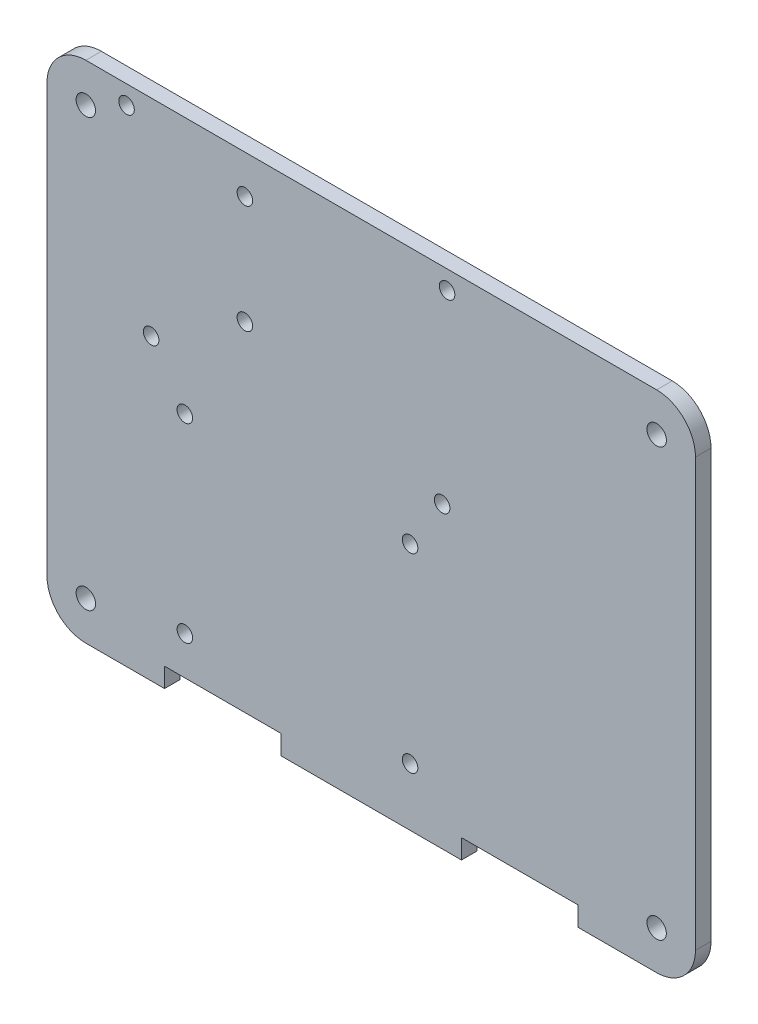
ISO-10303-21;
HEADER;
FILE_DESCRIPTION(('STEP AP214'),'2;1');
FILE_NAME('part.step','',(''),(''),'','','');
FILE_SCHEMA(('AUTOMOTIVE_DESIGN { 1 0 10303 214 1 1 1 1 }'));
ENDSEC;
DATA;
#1=APPLICATION_CONTEXT('core data for automotive mechanical design processes');
#2=APPLICATION_PROTOCOL_DEFINITION('international standard','automotive_design',2000,#1);
#3=PRODUCT_CONTEXT('',#1,'mechanical');
#4=PRODUCT('Part','Part','',(#3));
#5=PRODUCT_RELATED_PRODUCT_CATEGORY('part','',(#4));
#6=PRODUCT_DEFINITION_FORMATION('','',#4);
#7=PRODUCT_DEFINITION_CONTEXT('part definition',#1,'design');
#8=PRODUCT_DEFINITION('design','',#6,#7);
#9=PRODUCT_DEFINITION_SHAPE('','',#8);
#10=(LENGTH_UNIT() NAMED_UNIT(*) SI_UNIT(.MILLI.,.METRE.));
#11=(NAMED_UNIT(*) PLANE_ANGLE_UNIT() SI_UNIT($,.RADIAN.));
#12=(NAMED_UNIT(*) SI_UNIT($,.STERADIAN.) SOLID_ANGLE_UNIT());
#13=UNCERTAINTY_MEASURE_WITH_UNIT(LENGTH_MEASURE(1.E-05),#10,'distance_accuracy_value','');
#14=(GEOMETRIC_REPRESENTATION_CONTEXT(3) GLOBAL_UNCERTAINTY_ASSIGNED_CONTEXT((#13)) GLOBAL_UNIT_ASSIGNED_CONTEXT((#10,
#11,#12)) REPRESENTATION_CONTEXT('',''));
#15=CARTESIAN_POINT('',(0.,0.,0.));
#16=DIRECTION('',(0.,0.,1.));
#17=DIRECTION('',(1.,0.,0.));
#18=AXIS2_PLACEMENT_3D('',#15,#16,#17);
#19=CARTESIAN_POINT('',(-83.5,-65.,4.));
#20=DIRECTION('',(0.,1.,0.));
#21=DIRECTION('',(0.,0.,1.));
#22=AXIS2_PLACEMENT_3D('',#19,#20,#21);
#23=PLANE('',#22);
#24=DIRECTION('',(1.,0.,0.));
#25=VECTOR('',#24,1.);
#26=CARTESIAN_POINT('',(-83.5,-65.,0.));
#27=LINE('',#26,#25);
#28=CARTESIAN_POINT('',(-73.5,-65.,0.));
#29=VERTEX_POINT('',#28);
#30=CARTESIAN_POINT('',(-53.2337974141173,-65.,0.));
#31=VERTEX_POINT('',#30);
#32=EDGE_CURVE('E164',#29,#31,#27,.T.);
#33=ORIENTED_EDGE('',*,*,#32,.T.);
#34=DIRECTION('',(0.,0.,1.));
#35=VECTOR('',#34,1.);
#36=CARTESIAN_POINT('',(-53.2337974141173,-65.,-6.));
#37=LINE('',#36,#35);
#38=CARTESIAN_POINT('',(-53.2337974141173,-65.,4.));
#39=VERTEX_POINT('',#38);
#40=EDGE_CURVE('E147',#31,#39,#37,.T.);
#41=ORIENTED_EDGE('',*,*,#40,.T.);
#42=DIRECTION('',(1.,0.,0.));
#43=VECTOR('',#42,1.);
#44=CARTESIAN_POINT('',(-83.5,-65.,4.));
#45=LINE('',#44,#43);
#46=CARTESIAN_POINT('',(-73.5,-65.,4.));
#47=VERTEX_POINT('',#46);
#48=EDGE_CURVE('E161',#47,#39,#45,.T.);
#49=ORIENTED_EDGE('',*,*,#48,.F.);
#50=DIRECTION('',(0.,0.,-1.));
#51=VECTOR('',#50,1.);
#52=CARTESIAN_POINT('',(-73.5,-65.,4.));
#53=LINE('',#52,#51);
#54=EDGE_CURVE('E173',#47,#29,#53,.T.);
#55=ORIENTED_EDGE('',*,*,#54,.T.);
#56=EDGE_LOOP('',(#33,#41,#49,#55));
#57=FACE_BOUND('',#56,.T.);
#58=ADVANCED_FACE('F32',(#57),#23,.F.);
#59=CARTESIAN_POINT('',(53.2337974141174,-65.,4.));
#60=VERTEX_POINT('',#59);
#61=CARTESIAN_POINT('',(73.5,-65.,4.));
#62=VERTEX_POINT('',#61);
#63=EDGE_CURVE('E176',#60,#62,#45,.T.);
#64=ORIENTED_EDGE('',*,*,#63,.F.);
#65=DIRECTION('',(0.,0.,1.));
#66=VECTOR('',#65,1.);
#67=CARTESIAN_POINT('',(53.2337974141174,-65.,-6.));
#68=LINE('',#67,#66);
#69=CARTESIAN_POINT('',(53.2337974141174,-65.,0.));
#70=VERTEX_POINT('',#69);
#71=EDGE_CURVE('E155',#70,#60,#68,.T.);
#72=ORIENTED_EDGE('',*,*,#71,.F.);
#73=CARTESIAN_POINT('',(73.5,-65.,0.));
#74=VERTEX_POINT('',#73);
#75=EDGE_CURVE('E424',#70,#74,#27,.T.);
#76=ORIENTED_EDGE('',*,*,#75,.T.);
#77=DIRECTION('',(0.,0.,-1.));
#78=VECTOR('',#77,1.);
#79=CARTESIAN_POINT('',(73.5000000000001,-65.,4.));
#80=LINE('',#79,#78);
#81=EDGE_CURVE('E395',#74,#62,#80,.F.);
#82=ORIENTED_EDGE('',*,*,#81,.T.);
#83=EDGE_LOOP('',(#64,#72,#76,#82));
#84=FACE_BOUND('',#83,.T.);
#85=ADVANCED_FACE('F337',(#84),#23,.F.);
#86=CARTESIAN_POINT('',(83.5,65.,4.));
#87=DIRECTION('',(-1.,0.,0.));
#88=DIRECTION('',(0.,-1.,0.));
#89=AXIS2_PLACEMENT_3D('',#86,#87,#88);
#90=PLANE('',#89);
#91=DIRECTION('',(0.,1.,0.));
#92=VECTOR('',#91,1.);
#93=CARTESIAN_POINT('',(83.5,65.,4.));
#94=LINE('',#93,#92);
#95=CARTESIAN_POINT('',(83.5,-55.,4.));
#96=VERTEX_POINT('',#95);
#97=CARTESIAN_POINT('',(83.5,55.,4.));
#98=VERTEX_POINT('',#97);
#99=EDGE_CURVE('E188',#96,#98,#94,.T.);
#100=ORIENTED_EDGE('',*,*,#99,.F.);
#101=DIRECTION('',(0.,0.,-1.));
#102=VECTOR('',#101,1.);
#103=CARTESIAN_POINT('',(83.5,-55.,4.));
#104=LINE('',#103,#102);
#105=CARTESIAN_POINT('',(83.5,-55.,0.));
#106=VERTEX_POINT('',#105);
#107=EDGE_CURVE('E402',#96,#106,#104,.T.);
#108=ORIENTED_EDGE('',*,*,#107,.T.);
#109=DIRECTION('',(0.,1.,0.));
#110=VECTOR('',#109,1.);
#111=CARTESIAN_POINT('',(83.5,65.,0.));
#112=LINE('',#111,#110);
#113=CARTESIAN_POINT('',(83.5,55.,0.));
#114=VERTEX_POINT('',#113);
#115=EDGE_CURVE('E380',#106,#114,#112,.T.);
#116=ORIENTED_EDGE('',*,*,#115,.T.);
#117=DIRECTION('',(0.,0.,-1.));
#118=VECTOR('',#117,1.);
#119=CARTESIAN_POINT('',(83.5,55.,4.));
#120=LINE('',#119,#118);
#121=EDGE_CURVE('E405',#114,#98,#120,.F.);
#122=ORIENTED_EDGE('',*,*,#121,.T.);
#123=EDGE_LOOP('',(#100,#108,#116,#122));
#124=FACE_BOUND('',#123,.T.);
#125=ADVANCED_FACE('F342',(#124),#90,.F.);
#126=CARTESIAN_POINT('',(-83.5,65.,4.));
#127=DIRECTION('',(0.,-1.,0.));
#128=DIRECTION('',(0.,0.,-1.));
#129=AXIS2_PLACEMENT_3D('',#126,#127,#128);
#130=PLANE('',#129);
#131=DIRECTION('',(-1.,0.,0.));
#132=VECTOR('',#131,1.);
#133=CARTESIAN_POINT('',(-83.5,65.,4.));
#134=LINE('',#133,#132);
#135=CARTESIAN_POINT('',(73.5,65.,4.));
#136=VERTEX_POINT('',#135);
#137=CARTESIAN_POINT('',(-73.5,65.,4.));
#138=VERTEX_POINT('',#137);
#139=EDGE_CURVE('E186',#136,#138,#134,.T.);
#140=ORIENTED_EDGE('',*,*,#139,.F.);
#141=DIRECTION('',(0.,0.,-1.));
#142=VECTOR('',#141,1.);
#143=CARTESIAN_POINT('',(73.5,65.,4.));
#144=LINE('',#143,#142);
#145=CARTESIAN_POINT('',(73.5,65.,0.));
#146=VERTEX_POINT('',#145);
#147=EDGE_CURVE('E376',#136,#146,#144,.T.);
#148=ORIENTED_EDGE('',*,*,#147,.T.);
#149=DIRECTION('',(-1.,0.,0.));
#150=VECTOR('',#149,1.);
#151=CARTESIAN_POINT('',(-83.5,65.,0.));
#152=LINE('',#151,#150);
#153=CARTESIAN_POINT('',(-73.5,65.,0.));
#154=VERTEX_POINT('',#153);
#155=EDGE_CURVE('E428',#146,#154,#152,.T.);
#156=ORIENTED_EDGE('',*,*,#155,.T.);
#157=DIRECTION('',(0.,0.,-1.));
#158=VECTOR('',#157,1.);
#159=CARTESIAN_POINT('',(-73.5,65.,4.));
#160=LINE('',#159,#158);
#161=EDGE_CURVE('E407',#154,#138,#160,.F.);
#162=ORIENTED_EDGE('',*,*,#161,.T.);
#163=EDGE_LOOP('',(#140,#148,#156,#162));
#164=FACE_BOUND('',#163,.T.);
#165=ADVANCED_FACE('F352',(#164),#130,.F.);
#166=CARTESIAN_POINT('',(-83.5,65.,4.));
#167=DIRECTION('',(1.,0.,0.));
#168=DIRECTION('',(0.,1.,0.));
#169=AXIS2_PLACEMENT_3D('',#166,#167,#168);
#170=PLANE('',#169);
#171=DIRECTION('',(0.,-1.,0.));
#172=VECTOR('',#171,1.);
#173=CARTESIAN_POINT('',(-83.5,65.,0.));
#174=LINE('',#173,#172);
#175=CARTESIAN_POINT('',(-83.5,55.,0.));
#176=VERTEX_POINT('',#175);
#177=CARTESIAN_POINT('',(-83.5,-55.,0.));
#178=VERTEX_POINT('',#177);
#179=EDGE_CURVE('E425',#176,#178,#174,.T.);
#180=ORIENTED_EDGE('',*,*,#179,.T.);
#181=DIRECTION('',(0.,0.,-1.));
#182=VECTOR('',#181,1.);
#183=CARTESIAN_POINT('',(-83.5,-55.,4.));
#184=LINE('',#183,#182);
#185=CARTESIAN_POINT('',(-83.5,-55.,4.));
#186=VERTEX_POINT('',#185);
#187=EDGE_CURVE('E413',#178,#186,#184,.F.);
#188=ORIENTED_EDGE('',*,*,#187,.T.);
#189=DIRECTION('',(0.,-1.,0.));
#190=VECTOR('',#189,1.);
#191=CARTESIAN_POINT('',(-83.5,65.,4.));
#192=LINE('',#191,#190);
#193=CARTESIAN_POINT('',(-83.5,55.,4.));
#194=VERTEX_POINT('',#193);
#195=EDGE_CURVE('E182',#194,#186,#192,.T.);
#196=ORIENTED_EDGE('',*,*,#195,.F.);
#197=DIRECTION('',(0.,0.,-1.));
#198=VECTOR('',#197,1.);
#199=CARTESIAN_POINT('',(-83.5,55.,4.));
#200=LINE('',#199,#198);
#201=EDGE_CURVE('E415',#194,#176,#200,.T.);
#202=ORIENTED_EDGE('',*,*,#201,.T.);
#203=EDGE_LOOP('',(#180,#188,#196,#202));
#204=FACE_BOUND('',#203,.T.);
#205=ADVANCED_FACE('F347',(#204),#170,.F.);
#206=CARTESIAN_POINT('',(-23.2337974141174,-65.,4.));
#207=VERTEX_POINT('',#206);
#208=CARTESIAN_POINT('',(23.2337974141174,-65.,4.));
#209=VERTEX_POINT('',#208);
#210=EDGE_CURVE('E174',#207,#209,#45,.T.);
#211=ORIENTED_EDGE('',*,*,#210,.F.);
#212=DIRECTION('',(0.,0.,1.));
#213=VECTOR('',#212,1.);
#214=CARTESIAN_POINT('',(-23.2337974141174,-65.,-6.));
#215=LINE('',#214,#213);
#216=CARTESIAN_POINT('',(-23.2337974141174,-65.,0.));
#217=VERTEX_POINT('',#216);
#218=EDGE_CURVE('E165',#217,#207,#215,.T.);
#219=ORIENTED_EDGE('',*,*,#218,.F.);
#220=CARTESIAN_POINT('',(23.2337974141174,-65.,0.));
#221=VERTEX_POINT('',#220);
#222=EDGE_CURVE('E423',#217,#221,#27,.T.);
#223=ORIENTED_EDGE('',*,*,#222,.T.);
#224=DIRECTION('',(0.,0.,1.));
#225=VECTOR('',#224,1.);
#226=CARTESIAN_POINT('',(23.2337974141174,-65.,-6.));
#227=LINE('',#226,#225);
#228=EDGE_CURVE('E210',#221,#209,#227,.T.);
#229=ORIENTED_EDGE('',*,*,#228,.T.);
#230=EDGE_LOOP('',(#211,#219,#223,#229));
#231=FACE_BOUND('',#230,.T.);
#232=ADVANCED_FACE('F298',(#231),#23,.F.);
#233=CARTESIAN_POINT('',(0.,0.,4.));
#234=DIRECTION('',(0.,0.,1.));
#235=DIRECTION('',(1.,0.,0.));
#236=AXIS2_PLACEMENT_3D('',#233,#234,#235);
#237=PLANE('',#236);
#238=CARTESIAN_POINT('',(-63.0199999999999,60.1901793205921,4.));
#239=DIRECTION('',(0.,0.,1.));
#240=DIRECTION('',(1.,0.,0.));
#241=AXIS2_PLACEMENT_3D('',#238,#239,#240);
#242=CIRCLE('',#241,2.);
#243=CARTESIAN_POINT('',(-61.0199999999999,60.1901793205921,4.));
#244=VERTEX_POINT('',#243);
#245=EDGE_CURVE('E280',#244,#244,#242,.T.);
#246=ORIENTED_EDGE('',*,*,#245,.F.);
#247=EDGE_LOOP('',(#246));
#248=FACE_BOUND('',#247,.T.);
#249=CARTESIAN_POINT('',(-32.5399999999999,55.1101793205921,4.));
#250=DIRECTION('',(0.,0.,1.));
#251=DIRECTION('',(1.,0.,0.));
#252=AXIS2_PLACEMENT_3D('',#249,#250,#251);
#253=CIRCLE('',#252,2.);
#254=CARTESIAN_POINT('',(-30.5399999999999,55.1101793205921,4.));
#255=VERTEX_POINT('',#254);
#256=EDGE_CURVE('E274',#255,#255,#253,.T.);
#257=ORIENTED_EDGE('',*,*,#256,.F.);
#258=EDGE_LOOP('',(#257));
#259=FACE_BOUND('',#258,.T.);
#260=CARTESIAN_POINT('',(-32.5399999999999,27.1701793205921,4.));
#261=DIRECTION('',(0.,0.,1.));
#262=DIRECTION('',(1.,0.,0.));
#263=AXIS2_PLACEMENT_3D('',#260,#261,#262);
#264=CIRCLE('',#263,2.);
#265=CARTESIAN_POINT('',(-30.5399999999999,27.1701793205921,4.));
#266=VERTEX_POINT('',#265);
#267=EDGE_CURVE('E268',#266,#266,#264,.T.);
#268=ORIENTED_EDGE('',*,*,#267,.F.);
#269=EDGE_LOOP('',(#268));
#270=FACE_BOUND('',#269,.T.);
#271=CARTESIAN_POINT('',(19.5300000000001,60.1901793205921,4.));
#272=DIRECTION('',(0.,0.,1.));
#273=DIRECTION('',(1.,0.,0.));
#274=AXIS2_PLACEMENT_3D('',#271,#272,#273);
#275=CIRCLE('',#274,2.);
#276=CARTESIAN_POINT('',(21.5300000000001,60.1901793205921,4.));
#277=VERTEX_POINT('',#276);
#278=EDGE_CURVE('E262',#277,#277,#275,.T.);
#279=ORIENTED_EDGE('',*,*,#278,.F.);
#280=EDGE_LOOP('',(#279));
#281=FACE_BOUND('',#280,.T.);
#282=CARTESIAN_POINT('',(18.2600000000001,11.9301793205921,4.));
#283=DIRECTION('',(0.,0.,1.));
#284=DIRECTION('',(1.,0.,0.));
#285=AXIS2_PLACEMENT_3D('',#282,#283,#284);
#286=CIRCLE('',#285,2.);
#287=CARTESIAN_POINT('',(20.2600000000001,11.9301793205921,4.));
#288=VERTEX_POINT('',#287);
#289=EDGE_CURVE('E256',#288,#288,#286,.T.);
#290=ORIENTED_EDGE('',*,*,#289,.F.);
#291=EDGE_LOOP('',(#290));
#292=FACE_BOUND('',#291,.T.);
#293=CARTESIAN_POINT('',(-56.6699999999999,11.9301793205921,4.));
#294=DIRECTION('',(0.,0.,1.));
#295=DIRECTION('',(1.,0.,0.));
#296=AXIS2_PLACEMENT_3D('',#293,#294,#295);
#297=CIRCLE('',#296,2.);
#298=CARTESIAN_POINT('',(-54.6699999999999,11.9301793205921,4.));
#299=VERTEX_POINT('',#298);
#300=EDGE_CURVE('E250',#299,#299,#297,.T.);
#301=ORIENTED_EDGE('',*,*,#300,.F.);
#302=EDGE_LOOP('',(#301));
#303=FACE_BOUND('',#302,.T.);
#304=CARTESIAN_POINT('',(10.,-1.10624537225093,4.));
#305=DIRECTION('',(0.,0.,1.));
#306=DIRECTION('',(1.,0.,0.));
#307=AXIS2_PLACEMENT_3D('',#304,#305,#306);
#308=CIRCLE('',#307,2.);
#309=CARTESIAN_POINT('',(12.,-1.10624537225093,4.));
#310=VERTEX_POINT('',#309);
#311=EDGE_CURVE('E232',#310,#310,#308,.T.);
#312=ORIENTED_EDGE('',*,*,#311,.F.);
#313=EDGE_LOOP('',(#312));
#314=FACE_BOUND('',#313,.T.);
#315=CARTESIAN_POINT('',(-48.,-50.106245372251,4.));
#316=DIRECTION('',(0.,0.,1.));
#317=DIRECTION('',(1.,0.,0.));
#318=AXIS2_PLACEMENT_3D('',#315,#316,#317);
#319=CIRCLE('',#318,2.);
#320=CARTESIAN_POINT('',(-46.,-50.106245372251,4.));
#321=VERTEX_POINT('',#320);
#322=EDGE_CURVE('E239',#321,#321,#319,.T.);
#323=ORIENTED_EDGE('',*,*,#322,.F.);
#324=EDGE_LOOP('',(#323));
#325=FACE_BOUND('',#324,.T.);
#326=CARTESIAN_POINT('',(10.,-50.1062453722509,4.));
#327=DIRECTION('',(0.,0.,1.));
#328=DIRECTION('',(1.,0.,0.));
#329=AXIS2_PLACEMENT_3D('',#326,#327,#328);
#330=CIRCLE('',#329,2.);
#331=CARTESIAN_POINT('',(12.,-50.1062453722509,4.));
#332=VERTEX_POINT('',#331);
#333=EDGE_CURVE('E245',#332,#332,#330,.T.);
#334=ORIENTED_EDGE('',*,*,#333,.F.);
#335=EDGE_LOOP('',(#334));
#336=FACE_BOUND('',#335,.T.);
#337=CARTESIAN_POINT('',(-48.,-1.10624537225095,4.));
#338=DIRECTION('',(0.,0.,1.));
#339=DIRECTION('',(1.,0.,0.));
#340=AXIS2_PLACEMENT_3D('',#337,#338,#339);
#341=CIRCLE('',#340,2.);
#342=CARTESIAN_POINT('',(-46.,-1.10624537225095,4.));
#343=VERTEX_POINT('',#342);
#344=EDGE_CURVE('E226',#343,#343,#341,.T.);
#345=ORIENTED_EDGE('',*,*,#344,.F.);
#346=EDGE_LOOP('',(#345));
#347=FACE_BOUND('',#346,.T.);
#348=DIRECTION('',(0.,-1.,0.));
#349=VECTOR('',#348,1.);
#350=CARTESIAN_POINT('',(-53.2337974141173,-65.,4.));
#351=LINE('',#350,#349);
#352=CARTESIAN_POINT('',(-53.2337974141173,-60.,4.));
#353=VERTEX_POINT('',#352);
#354=EDGE_CURVE('E144',#353,#39,#351,.T.);
#355=ORIENTED_EDGE('',*,*,#354,.F.);
#356=DIRECTION('',(-1.,0.,0.));
#357=VECTOR('',#356,1.);
#358=CARTESIAN_POINT('',(-53.2337974141173,-60.,4.));
#359=LINE('',#358,#357);
#360=CARTESIAN_POINT('',(-23.2337974141174,-60.,4.));
#361=VERTEX_POINT('',#360);
#362=EDGE_CURVE('E166',#361,#353,#359,.T.);
#363=ORIENTED_EDGE('',*,*,#362,.F.);
#364=DIRECTION('',(0.,1.,0.));
#365=VECTOR('',#364,1.);
#366=CARTESIAN_POINT('',(-23.2337974141174,-65.,4.));
#367=LINE('',#366,#365);
#368=EDGE_CURVE('E154',#207,#361,#367,.T.);
#369=ORIENTED_EDGE('',*,*,#368,.F.);
#370=ORIENTED_EDGE('',*,*,#210,.T.);
#371=DIRECTION('',(0.,-1.,0.));
#372=VECTOR('',#371,1.);
#373=CARTESIAN_POINT('',(23.2337974141174,-65.,4.));
#374=LINE('',#373,#372);
#375=CARTESIAN_POINT('',(23.2337974141174,-60.,4.));
#376=VERTEX_POINT('',#375);
#377=EDGE_CURVE('E208',#376,#209,#374,.T.);
#378=ORIENTED_EDGE('',*,*,#377,.F.);
#379=DIRECTION('',(-1.,0.,0.));
#380=VECTOR('',#379,1.);
#381=CARTESIAN_POINT('',(53.2337974141174,-60.,4.));
#382=LINE('',#381,#380);
#383=CARTESIAN_POINT('',(53.2337974141174,-60.,4.));
#384=VERTEX_POINT('',#383);
#385=EDGE_CURVE('E215',#384,#376,#382,.T.);
#386=ORIENTED_EDGE('',*,*,#385,.F.);
#387=DIRECTION('',(0.,1.,0.));
#388=VECTOR('',#387,1.);
#389=CARTESIAN_POINT('',(53.2337974141174,-65.,4.));
#390=LINE('',#389,#388);
#391=EDGE_CURVE('E217',#60,#384,#390,.T.);
#392=ORIENTED_EDGE('',*,*,#391,.F.);
#393=ORIENTED_EDGE('',*,*,#63,.T.);
#394=CARTESIAN_POINT('',(73.5000000000001,-55.,4.));
#395=DIRECTION('',(0.,0.,1.));
#396=DIRECTION('',(1.,0.,0.));
#397=AXIS2_PLACEMENT_3D('',#394,#395,#396);
#398=CIRCLE('',#397,10.);
#399=EDGE_CURVE('E391',#62,#96,#398,.T.);
#400=ORIENTED_EDGE('',*,*,#399,.T.);
#401=ORIENTED_EDGE('',*,*,#99,.T.);
#402=CARTESIAN_POINT('',(73.5,55.,4.));
#403=DIRECTION('',(0.,0.,1.));
#404=DIRECTION('',(1.,0.,0.));
#405=AXIS2_PLACEMENT_3D('',#402,#403,#404);
#406=CIRCLE('',#405,10.);
#407=EDGE_CURVE('E393',#98,#136,#406,.T.);
#408=ORIENTED_EDGE('',*,*,#407,.T.);
#409=ORIENTED_EDGE('',*,*,#139,.T.);
#410=CARTESIAN_POINT('',(-73.5,55.,4.));
#411=DIRECTION('',(0.,0.,1.));
#412=DIRECTION('',(1.,0.,0.));
#413=AXIS2_PLACEMENT_3D('',#410,#411,#412);
#414=CIRCLE('',#413,10.);
#415=EDGE_CURVE('E411',#138,#194,#414,.T.);
#416=ORIENTED_EDGE('',*,*,#415,.T.);
#417=ORIENTED_EDGE('',*,*,#195,.T.);
#418=CARTESIAN_POINT('',(-73.5,-55.,4.));
#419=DIRECTION('',(0.,0.,1.));
#420=DIRECTION('',(1.,0.,0.));
#421=AXIS2_PLACEMENT_3D('',#418,#419,#420);
#422=CIRCLE('',#421,10.);
#423=EDGE_CURVE('E172',#186,#47,#422,.T.);
#424=ORIENTED_EDGE('',*,*,#423,.T.);
#425=ORIENTED_EDGE('',*,*,#48,.T.);
#426=EDGE_LOOP('',(#355,#363,#369,#370,#378,#386,#392,#393,#400,#401,#408,#409,#416,#417,#424,#425));
#427=FACE_BOUND('',#426,.T.);
#428=CARTESIAN_POINT('',(73.5,55.,4.));
#429=DIRECTION('',(0.,0.,1.));
#430=DIRECTION('',(1.,0.,0.));
#431=AXIS2_PLACEMENT_3D('',#428,#429,#430);
#432=CIRCLE('',#431,2.5);
#433=CARTESIAN_POINT('',(76.,55.,4.));
#434=VERTEX_POINT('',#433);
#435=EDGE_CURVE('E197',#434,#434,#432,.T.);
#436=ORIENTED_EDGE('',*,*,#435,.F.);
#437=EDGE_LOOP('',(#436));
#438=FACE_BOUND('',#437,.T.);
#439=CARTESIAN_POINT('',(-73.5,-55.,4.));
#440=DIRECTION('',(0.,0.,1.));
#441=DIRECTION('',(1.,0.,0.));
#442=AXIS2_PLACEMENT_3D('',#439,#440,#441);
#443=CIRCLE('',#442,2.50000000000001);
#444=CARTESIAN_POINT('',(-71.,-55.,4.));
#445=VERTEX_POINT('',#444);
#446=EDGE_CURVE('E198',#445,#445,#443,.T.);
#447=ORIENTED_EDGE('',*,*,#446,.F.);
#448=EDGE_LOOP('',(#447));
#449=FACE_BOUND('',#448,.T.);
#450=CARTESIAN_POINT('',(73.5000000000001,-55.,4.));
#451=DIRECTION('',(0.,0.,1.));
#452=DIRECTION('',(1.,0.,0.));
#453=AXIS2_PLACEMENT_3D('',#450,#451,#452);
#454=CIRCLE('',#453,2.50000000000001);
#455=CARTESIAN_POINT('',(76.0000000000001,-55.,4.));
#456=VERTEX_POINT('',#455);
#457=EDGE_CURVE('E201',#456,#456,#454,.T.);
#458=ORIENTED_EDGE('',*,*,#457,.F.);
#459=EDGE_LOOP('',(#458));
#460=FACE_BOUND('',#459,.T.);
#461=CARTESIAN_POINT('',(-73.5,55.,4.));
#462=DIRECTION('',(0.,0.,1.));
#463=DIRECTION('',(1.,0.,0.));
#464=AXIS2_PLACEMENT_3D('',#461,#462,#463);
#465=CIRCLE('',#464,2.50000000000001);
#466=CARTESIAN_POINT('',(-71.,55.,4.));
#467=VERTEX_POINT('',#466);
#468=EDGE_CURVE('E193',#467,#467,#465,.T.);
#469=ORIENTED_EDGE('',*,*,#468,.F.);
#470=EDGE_LOOP('',(#469));
#471=FACE_BOUND('',#470,.T.);
#472=ADVANCED_FACE('F168',(#248,#259,#270,#281,#292,#303,#314,#325,#336,#347,#427,#438,#449,
#460,#471),#237,.T.);
#473=CARTESIAN_POINT('',(0.,0.,0.));
#474=DIRECTION('',(0.,0.,1.));
#475=DIRECTION('',(1.,0.,0.));
#476=AXIS2_PLACEMENT_3D('',#473,#474,#475);
#477=PLANE('',#476);
#478=CARTESIAN_POINT('',(-63.0199999999999,60.1901793205921,0.));
#479=DIRECTION('',(0.,0.,1.));
#480=DIRECTION('',(1.,0.,0.));
#481=AXIS2_PLACEMENT_3D('',#478,#479,#480);
#482=CIRCLE('',#481,2.);
#483=CARTESIAN_POINT('',(-61.0199999999999,60.1901793205921,0.));
#484=VERTEX_POINT('',#483);
#485=EDGE_CURVE('E236',#484,#484,#482,.T.);
#486=ORIENTED_EDGE('',*,*,#485,.T.);
#487=EDGE_LOOP('',(#486));
#488=FACE_BOUND('',#487,.T.);
#489=CARTESIAN_POINT('',(-32.5399999999999,55.1101793205921,0.));
#490=DIRECTION('',(0.,0.,1.));
#491=DIRECTION('',(1.,0.,0.));
#492=AXIS2_PLACEMENT_3D('',#489,#490,#491);
#493=CIRCLE('',#492,2.);
#494=CARTESIAN_POINT('',(-30.5399999999999,55.1101793205921,0.));
#495=VERTEX_POINT('',#494);
#496=EDGE_CURVE('E277',#495,#495,#493,.T.);
#497=ORIENTED_EDGE('',*,*,#496,.T.);
#498=EDGE_LOOP('',(#497));
#499=FACE_BOUND('',#498,.T.);
#500=CARTESIAN_POINT('',(-32.5399999999999,27.1701793205921,0.));
#501=DIRECTION('',(0.,0.,1.));
#502=DIRECTION('',(1.,0.,0.));
#503=AXIS2_PLACEMENT_3D('',#500,#501,#502);
#504=CIRCLE('',#503,2.);
#505=CARTESIAN_POINT('',(-30.5399999999999,27.1701793205921,0.));
#506=VERTEX_POINT('',#505);
#507=EDGE_CURVE('E271',#506,#506,#504,.T.);
#508=ORIENTED_EDGE('',*,*,#507,.T.);
#509=EDGE_LOOP('',(#508));
#510=FACE_BOUND('',#509,.T.);
#511=CARTESIAN_POINT('',(19.5300000000001,60.1901793205921,0.));
#512=DIRECTION('',(0.,0.,1.));
#513=DIRECTION('',(1.,0.,0.));
#514=AXIS2_PLACEMENT_3D('',#511,#512,#513);
#515=CIRCLE('',#514,2.);
#516=CARTESIAN_POINT('',(21.5300000000001,60.1901793205921,0.));
#517=VERTEX_POINT('',#516);
#518=EDGE_CURVE('E265',#517,#517,#515,.T.);
#519=ORIENTED_EDGE('',*,*,#518,.T.);
#520=EDGE_LOOP('',(#519));
#521=FACE_BOUND('',#520,.T.);
#522=CARTESIAN_POINT('',(18.2600000000001,11.9301793205921,0.));
#523=DIRECTION('',(0.,0.,1.));
#524=DIRECTION('',(1.,0.,0.));
#525=AXIS2_PLACEMENT_3D('',#522,#523,#524);
#526=CIRCLE('',#525,2.);
#527=CARTESIAN_POINT('',(20.2600000000001,11.9301793205921,0.));
#528=VERTEX_POINT('',#527);
#529=EDGE_CURVE('E259',#528,#528,#526,.T.);
#530=ORIENTED_EDGE('',*,*,#529,.T.);
#531=EDGE_LOOP('',(#530));
#532=FACE_BOUND('',#531,.T.);
#533=CARTESIAN_POINT('',(-56.6699999999999,11.9301793205921,0.));
#534=DIRECTION('',(0.,0.,1.));
#535=DIRECTION('',(1.,0.,0.));
#536=AXIS2_PLACEMENT_3D('',#533,#534,#535);
#537=CIRCLE('',#536,2.);
#538=CARTESIAN_POINT('',(-54.6699999999999,11.9301793205921,0.));
#539=VERTEX_POINT('',#538);
#540=EDGE_CURVE('E253',#539,#539,#537,.T.);
#541=ORIENTED_EDGE('',*,*,#540,.T.);
#542=EDGE_LOOP('',(#541));
#543=FACE_BOUND('',#542,.T.);
#544=CARTESIAN_POINT('',(10.,-1.10624537225093,0.));
#545=DIRECTION('',(0.,0.,1.));
#546=DIRECTION('',(1.,0.,0.));
#547=AXIS2_PLACEMENT_3D('',#544,#545,#546);
#548=CIRCLE('',#547,2.);
#549=CARTESIAN_POINT('',(12.,-1.10624537225093,0.));
#550=VERTEX_POINT('',#549);
#551=EDGE_CURVE('E235',#550,#550,#548,.T.);
#552=ORIENTED_EDGE('',*,*,#551,.T.);
#553=EDGE_LOOP('',(#552));
#554=FACE_BOUND('',#553,.T.);
#555=CARTESIAN_POINT('',(-48.,-50.106245372251,0.));
#556=DIRECTION('',(0.,0.,1.));
#557=DIRECTION('',(1.,0.,0.));
#558=AXIS2_PLACEMENT_3D('',#555,#556,#557);
#559=CIRCLE('',#558,2.);
#560=CARTESIAN_POINT('',(-46.,-50.106245372251,0.));
#561=VERTEX_POINT('',#560);
#562=EDGE_CURVE('E242',#561,#561,#559,.T.);
#563=ORIENTED_EDGE('',*,*,#562,.T.);
#564=EDGE_LOOP('',(#563));
#565=FACE_BOUND('',#564,.T.);
#566=CARTESIAN_POINT('',(10.,-50.1062453722509,0.));
#567=DIRECTION('',(0.,0.,1.));
#568=DIRECTION('',(1.,0.,0.));
#569=AXIS2_PLACEMENT_3D('',#566,#567,#568);
#570=CIRCLE('',#569,2.);
#571=CARTESIAN_POINT('',(12.,-50.1062453722509,0.));
#572=VERTEX_POINT('',#571);
#573=EDGE_CURVE('E229',#572,#572,#570,.T.);
#574=ORIENTED_EDGE('',*,*,#573,.T.);
#575=EDGE_LOOP('',(#574));
#576=FACE_BOUND('',#575,.T.);
#577=CARTESIAN_POINT('',(-48.,-1.10624537225095,0.));
#578=DIRECTION('',(0.,0.,1.));
#579=DIRECTION('',(1.,0.,0.));
#580=AXIS2_PLACEMENT_3D('',#577,#578,#579);
#581=CIRCLE('',#580,2.);
#582=CARTESIAN_POINT('',(-46.,-1.10624537225095,0.));
#583=VERTEX_POINT('',#582);
#584=EDGE_CURVE('E219',#583,#583,#581,.T.);
#585=ORIENTED_EDGE('',*,*,#584,.T.);
#586=EDGE_LOOP('',(#585));
#587=FACE_BOUND('',#586,.T.);
#588=DIRECTION('',(-1.,0.,0.));
#589=VECTOR('',#588,1.);
#590=CARTESIAN_POINT('',(0.,-60.,0.));
#591=LINE('',#590,#589);
#592=CARTESIAN_POINT('',(-23.2337974141174,-60.,0.));
#593=VERTEX_POINT('',#592);
#594=CARTESIAN_POINT('',(-53.2337974141173,-60.,0.));
#595=VERTEX_POINT('',#594);
#596=EDGE_CURVE('E40',#593,#595,#591,.T.);
#597=ORIENTED_EDGE('',*,*,#596,.T.);
#598=DIRECTION('',(0.,-1.,0.));
#599=VECTOR('',#598,1.);
#600=CARTESIAN_POINT('',(-53.2337974141173,0.,0.));
#601=LINE('',#600,#599);
#602=EDGE_CURVE('E11',#595,#31,#601,.T.);
#603=ORIENTED_EDGE('',*,*,#602,.T.);
#604=ORIENTED_EDGE('',*,*,#32,.F.);
#605=CARTESIAN_POINT('',(-73.5,-55.,0.));
#606=DIRECTION('',(0.,0.,1.));
#607=DIRECTION('',(1.,0.,0.));
#608=AXIS2_PLACEMENT_3D('',#605,#606,#607);
#609=CIRCLE('',#608,10.);
#610=EDGE_CURVE('E418',#29,#178,#609,.F.);
#611=ORIENTED_EDGE('',*,*,#610,.T.);
#612=ORIENTED_EDGE('',*,*,#179,.F.);
#613=CARTESIAN_POINT('',(-73.5,55.,0.));
#614=DIRECTION('',(0.,0.,1.));
#615=DIRECTION('',(1.,0.,0.));
#616=AXIS2_PLACEMENT_3D('',#613,#614,#615);
#617=CIRCLE('',#616,10.);
#618=EDGE_CURVE('E177',#176,#154,#617,.F.);
#619=ORIENTED_EDGE('',*,*,#618,.T.);
#620=ORIENTED_EDGE('',*,*,#155,.F.);
#621=CARTESIAN_POINT('',(73.5,55.,0.));
#622=DIRECTION('',(0.,0.,1.));
#623=DIRECTION('',(1.,0.,0.));
#624=AXIS2_PLACEMENT_3D('',#621,#622,#623);
#625=CIRCLE('',#624,10.);
#626=EDGE_CURVE('E400',#146,#114,#625,.F.);
#627=ORIENTED_EDGE('',*,*,#626,.T.);
#628=ORIENTED_EDGE('',*,*,#115,.F.);
#629=CARTESIAN_POINT('',(73.5000000000001,-55.,0.));
#630=DIRECTION('',(0.,0.,1.));
#631=DIRECTION('',(1.,0.,0.));
#632=AXIS2_PLACEMENT_3D('',#629,#630,#631);
#633=CIRCLE('',#632,10.);
#634=EDGE_CURVE('E397',#106,#74,#633,.F.);
#635=ORIENTED_EDGE('',*,*,#634,.T.);
#636=ORIENTED_EDGE('',*,*,#75,.F.);
#637=DIRECTION('',(0.,1.,0.));
#638=VECTOR('',#637,1.);
#639=CARTESIAN_POINT('',(53.2337974141174,0.,0.));
#640=LINE('',#639,#638);
#641=CARTESIAN_POINT('',(53.2337974141174,-60.,0.));
#642=VERTEX_POINT('',#641);
#643=EDGE_CURVE('E365',#70,#642,#640,.T.);
#644=ORIENTED_EDGE('',*,*,#643,.T.);
#645=DIRECTION('',(-1.,0.,0.));
#646=VECTOR('',#645,1.);
#647=CARTESIAN_POINT('',(0.,-60.,0.));
#648=LINE('',#647,#646);
#649=CARTESIAN_POINT('',(23.2337974141174,-60.,0.));
#650=VERTEX_POINT('',#649);
#651=EDGE_CURVE('E373',#642,#650,#648,.T.);
#652=ORIENTED_EDGE('',*,*,#651,.T.);
#653=DIRECTION('',(0.,-1.,0.));
#654=VECTOR('',#653,1.);
#655=CARTESIAN_POINT('',(23.2337974141174,0.,0.));
#656=LINE('',#655,#654);
#657=EDGE_CURVE('E368',#650,#221,#656,.T.);
#658=ORIENTED_EDGE('',*,*,#657,.T.);
#659=ORIENTED_EDGE('',*,*,#222,.F.);
#660=DIRECTION('',(0.,1.,0.));
#661=VECTOR('',#660,1.);
#662=CARTESIAN_POINT('',(-23.2337974141174,0.,0.));
#663=LINE('',#662,#661);
#664=EDGE_CURVE('E362',#217,#593,#663,.T.);
#665=ORIENTED_EDGE('',*,*,#664,.T.);
#666=EDGE_LOOP('',(#597,#603,#604,#611,#612,#619,#620,#627,#628,#635,#636,#644,#652,#658,#659,#665));
#667=FACE_BOUND('',#666,.T.);
#668=CARTESIAN_POINT('',(73.5,55.,0.));
#669=DIRECTION('',(0.,0.,1.));
#670=DIRECTION('',(1.,0.,0.));
#671=AXIS2_PLACEMENT_3D('',#668,#669,#670);
#672=CIRCLE('',#671,2.5);
#673=CARTESIAN_POINT('',(76.,55.,0.));
#674=VERTEX_POINT('',#673);
#675=EDGE_CURVE('E377',#674,#674,#672,.T.);
#676=ORIENTED_EDGE('',*,*,#675,.T.);
#677=EDGE_LOOP('',(#676));
#678=FACE_BOUND('',#677,.T.);
#679=CARTESIAN_POINT('',(-73.5,-55.,0.));
#680=DIRECTION('',(0.,0.,1.));
#681=DIRECTION('',(1.,0.,0.));
#682=AXIS2_PLACEMENT_3D('',#679,#680,#681);
#683=CIRCLE('',#682,2.50000000000001);
#684=CARTESIAN_POINT('',(-71.,-55.,0.));
#685=VERTEX_POINT('',#684);
#686=EDGE_CURVE('E381',#685,#685,#683,.T.);
#687=ORIENTED_EDGE('',*,*,#686,.T.);
#688=EDGE_LOOP('',(#687));
#689=FACE_BOUND('',#688,.T.);
#690=CARTESIAN_POINT('',(73.5000000000001,-55.,0.));
#691=DIRECTION('',(0.,0.,1.));
#692=DIRECTION('',(1.,0.,0.));
#693=AXIS2_PLACEMENT_3D('',#690,#691,#692);
#694=CIRCLE('',#693,2.50000000000001);
#695=CARTESIAN_POINT('',(76.0000000000001,-55.,0.));
#696=VERTEX_POINT('',#695);
#697=EDGE_CURVE('E384',#696,#696,#694,.T.);
#698=ORIENTED_EDGE('',*,*,#697,.T.);
#699=EDGE_LOOP('',(#698));
#700=FACE_BOUND('',#699,.T.);
#701=CARTESIAN_POINT('',(-73.5,55.,0.));
#702=DIRECTION('',(0.,0.,1.));
#703=DIRECTION('',(1.,0.,0.));
#704=AXIS2_PLACEMENT_3D('',#701,#702,#703);
#705=CIRCLE('',#704,2.50000000000001);
#706=CARTESIAN_POINT('',(-71.,55.,0.));
#707=VERTEX_POINT('',#706);
#708=EDGE_CURVE('E196',#707,#707,#705,.T.);
#709=ORIENTED_EDGE('',*,*,#708,.T.);
#710=EDGE_LOOP('',(#709));
#711=FACE_BOUND('',#710,.T.);
#712=ADVANCED_FACE('F286',(#488,#499,#510,#521,#532,#543,#554,#565,#576,#587,#667,#678,#689,
#700,#711),#477,.F.);
#713=CARTESIAN_POINT('',(-73.5,-55.,4.));
#714=DIRECTION('',(0.,0.,-1.));
#715=DIRECTION('',(-1.,0.,0.));
#716=AXIS2_PLACEMENT_3D('',#713,#714,#715);
#717=CYLINDRICAL_SURFACE('',#716,10.);
#718=ORIENTED_EDGE('',*,*,#423,.F.);
#719=ORIENTED_EDGE('',*,*,#187,.F.);
#720=ORIENTED_EDGE('',*,*,#610,.F.);
#721=ORIENTED_EDGE('',*,*,#54,.F.);
#722=EDGE_LOOP('',(#718,#719,#720,#721));
#723=FACE_BOUND('',#722,.T.);
#724=ADVANCED_FACE('F449',(#723),#717,.T.);
#725=CARTESIAN_POINT('',(-73.5,55.,4.));
#726=DIRECTION('',(0.,0.,-1.));
#727=DIRECTION('',(-1.,0.,0.));
#728=AXIS2_PLACEMENT_3D('',#725,#726,#727);
#729=CYLINDRICAL_SURFACE('',#728,10.);
#730=ORIENTED_EDGE('',*,*,#415,.F.);
#731=ORIENTED_EDGE('',*,*,#161,.F.);
#732=ORIENTED_EDGE('',*,*,#618,.F.);
#733=ORIENTED_EDGE('',*,*,#201,.F.);
#734=EDGE_LOOP('',(#730,#731,#732,#733));
#735=FACE_BOUND('',#734,.T.);
#736=ADVANCED_FACE('F445',(#735),#729,.T.);
#737=CARTESIAN_POINT('',(73.5000000000001,-55.,4.));
#738=DIRECTION('',(0.,0.,-1.));
#739=DIRECTION('',(-1.,0.,0.));
#740=AXIS2_PLACEMENT_3D('',#737,#738,#739);
#741=CYLINDRICAL_SURFACE('',#740,10.);
#742=ORIENTED_EDGE('',*,*,#399,.F.);
#743=ORIENTED_EDGE('',*,*,#81,.F.);
#744=ORIENTED_EDGE('',*,*,#634,.F.);
#745=ORIENTED_EDGE('',*,*,#107,.F.);
#746=EDGE_LOOP('',(#742,#743,#744,#745));
#747=FACE_BOUND('',#746,.T.);
#748=ADVANCED_FACE('F492',(#747),#741,.T.);
#749=CARTESIAN_POINT('',(73.5,55.,4.));
#750=DIRECTION('',(0.,0.,-1.));
#751=DIRECTION('',(-1.,0.,0.));
#752=AXIS2_PLACEMENT_3D('',#749,#750,#751);
#753=CYLINDRICAL_SURFACE('',#752,10.);
#754=ORIENTED_EDGE('',*,*,#407,.F.);
#755=ORIENTED_EDGE('',*,*,#121,.F.);
#756=ORIENTED_EDGE('',*,*,#626,.F.);
#757=ORIENTED_EDGE('',*,*,#147,.F.);
#758=EDGE_LOOP('',(#754,#755,#756,#757));
#759=FACE_BOUND('',#758,.T.);
#760=ADVANCED_FACE('F34',(#759),#753,.T.);
#761=CARTESIAN_POINT('',(-73.5,55.,-66.));
#762=DIRECTION('',(0.,0.,1.));
#763=DIRECTION('',(1.,0.,0.));
#764=AXIS2_PLACEMENT_3D('',#761,#762,#763);
#765=CYLINDRICAL_SURFACE('',#764,2.50000000000001);
#766=ORIENTED_EDGE('',*,*,#468,.T.);
#767=EDGE_LOOP('',(#766));
#768=FACE_BOUND('',#767,.T.);
#769=ORIENTED_EDGE('',*,*,#708,.F.);
#770=EDGE_LOOP('',(#769));
#771=FACE_BOUND('',#770,.T.);
#772=ADVANCED_FACE('F474',(#768,#771),#765,.F.);
#773=CARTESIAN_POINT('',(73.5000000000001,-55.,-66.));
#774=DIRECTION('',(0.,0.,1.));
#775=DIRECTION('',(1.,0.,0.));
#776=AXIS2_PLACEMENT_3D('',#773,#774,#775);
#777=CYLINDRICAL_SURFACE('',#776,2.50000000000001);
#778=ORIENTED_EDGE('',*,*,#457,.T.);
#779=EDGE_LOOP('',(#778));
#780=FACE_BOUND('',#779,.T.);
#781=ORIENTED_EDGE('',*,*,#697,.F.);
#782=EDGE_LOOP('',(#781));
#783=FACE_BOUND('',#782,.T.);
#784=ADVANCED_FACE('F470',(#780,#783),#777,.F.);
#785=CARTESIAN_POINT('',(-73.5,-55.,-66.));
#786=DIRECTION('',(0.,0.,1.));
#787=DIRECTION('',(1.,0.,0.));
#788=AXIS2_PLACEMENT_3D('',#785,#786,#787);
#789=CYLINDRICAL_SURFACE('',#788,2.50000000000001);
#790=ORIENTED_EDGE('',*,*,#446,.T.);
#791=EDGE_LOOP('',(#790));
#792=FACE_BOUND('',#791,.T.);
#793=ORIENTED_EDGE('',*,*,#686,.F.);
#794=EDGE_LOOP('',(#793));
#795=FACE_BOUND('',#794,.T.);
#796=ADVANCED_FACE('F473',(#792,#795),#789,.F.);
#797=CARTESIAN_POINT('',(73.5,55.,-66.));
#798=DIRECTION('',(0.,0.,1.));
#799=DIRECTION('',(1.,0.,0.));
#800=AXIS2_PLACEMENT_3D('',#797,#798,#799);
#801=CYLINDRICAL_SURFACE('',#800,2.5);
#802=ORIENTED_EDGE('',*,*,#435,.T.);
#803=EDGE_LOOP('',(#802));
#804=FACE_BOUND('',#803,.T.);
#805=ORIENTED_EDGE('',*,*,#675,.F.);
#806=EDGE_LOOP('',(#805));
#807=FACE_BOUND('',#806,.T.);
#808=ADVANCED_FACE('F468',(#804,#807),#801,.F.);
#809=CARTESIAN_POINT('',(53.2337974141174,-65.,-6.));
#810=DIRECTION('',(1.,0.,0.));
#811=DIRECTION('',(0.,0.,-1.));
#812=AXIS2_PLACEMENT_3D('',#809,#810,#811);
#813=PLANE('',#812);
#814=ORIENTED_EDGE('',*,*,#71,.T.);
#815=ORIENTED_EDGE('',*,*,#391,.T.);
#816=DIRECTION('',(0.,0.,1.));
#817=VECTOR('',#816,1.);
#818=CARTESIAN_POINT('',(53.2337974141174,-60.,-6.));
#819=LINE('',#818,#817);
#820=EDGE_CURVE('E206',#642,#384,#819,.T.);
#821=ORIENTED_EDGE('',*,*,#820,.F.);
#822=ORIENTED_EDGE('',*,*,#643,.F.);
#823=EDGE_LOOP('',(#814,#815,#821,#822));
#824=FACE_BOUND('',#823,.T.);
#825=ADVANCED_FACE('F462',(#824),#813,.F.);
#826=CARTESIAN_POINT('',(23.2337974141174,-65.,-6.));
#827=DIRECTION('',(-1.,0.,0.));
#828=DIRECTION('',(0.,0.,1.));
#829=AXIS2_PLACEMENT_3D('',#826,#827,#828);
#830=PLANE('',#829);
#831=DIRECTION('',(0.,0.,1.));
#832=VECTOR('',#831,1.);
#833=CARTESIAN_POINT('',(23.2337974141174,-60.,-6.));
#834=LINE('',#833,#832);
#835=EDGE_CURVE('E55',#650,#376,#834,.T.);
#836=ORIENTED_EDGE('',*,*,#835,.T.);
#837=ORIENTED_EDGE('',*,*,#377,.T.);
#838=ORIENTED_EDGE('',*,*,#228,.F.);
#839=ORIENTED_EDGE('',*,*,#657,.F.);
#840=EDGE_LOOP('',(#836,#837,#838,#839));
#841=FACE_BOUND('',#840,.T.);
#842=ADVANCED_FACE('F459',(#841),#830,.F.);
#843=CARTESIAN_POINT('',(53.2337974141174,-60.,-6.));
#844=DIRECTION('',(0.,1.,0.));
#845=DIRECTION('',(0.,0.,1.));
#846=AXIS2_PLACEMENT_3D('',#843,#844,#845);
#847=PLANE('',#846);
#848=ORIENTED_EDGE('',*,*,#820,.T.);
#849=ORIENTED_EDGE('',*,*,#385,.T.);
#850=ORIENTED_EDGE('',*,*,#835,.F.);
#851=ORIENTED_EDGE('',*,*,#651,.F.);
#852=EDGE_LOOP('',(#848,#849,#850,#851));
#853=FACE_BOUND('',#852,.T.);
#854=ADVANCED_FACE('F456',(#853),#847,.F.);
#855=CARTESIAN_POINT('',(-53.2337974141173,-65.,-6.));
#856=DIRECTION('',(-1.,0.,0.));
#857=DIRECTION('',(0.,0.,1.));
#858=AXIS2_PLACEMENT_3D('',#855,#856,#857);
#859=PLANE('',#858);
#860=DIRECTION('',(0.,0.,1.));
#861=VECTOR('',#860,1.);
#862=CARTESIAN_POINT('',(-53.2337974141173,-60.,-6.));
#863=LINE('',#862,#861);
#864=EDGE_CURVE('E149',#595,#353,#863,.T.);
#865=ORIENTED_EDGE('',*,*,#864,.T.);
#866=ORIENTED_EDGE('',*,*,#354,.T.);
#867=ORIENTED_EDGE('',*,*,#40,.F.);
#868=ORIENTED_EDGE('',*,*,#602,.F.);
#869=EDGE_LOOP('',(#865,#866,#867,#868));
#870=FACE_BOUND('',#869,.T.);
#871=ADVANCED_FACE('F146',(#870),#859,.F.);
#872=CARTESIAN_POINT('',(-53.2337974141173,-60.,-6.));
#873=DIRECTION('',(0.,1.,0.));
#874=DIRECTION('',(0.,0.,1.));
#875=AXIS2_PLACEMENT_3D('',#872,#873,#874);
#876=PLANE('',#875);
#877=DIRECTION('',(0.,0.,1.));
#878=VECTOR('',#877,1.);
#879=CARTESIAN_POINT('',(-23.2337974141174,-60.,-6.));
#880=LINE('',#879,#878);
#881=EDGE_CURVE('E47',#593,#361,#880,.T.);
#882=ORIENTED_EDGE('',*,*,#881,.T.);
#883=ORIENTED_EDGE('',*,*,#362,.T.);
#884=ORIENTED_EDGE('',*,*,#864,.F.);
#885=ORIENTED_EDGE('',*,*,#596,.F.);
#886=EDGE_LOOP('',(#882,#883,#884,#885));
#887=FACE_BOUND('',#886,.T.);
#888=ADVANCED_FACE('F331',(#887),#876,.F.);
#889=CARTESIAN_POINT('',(-23.2337974141174,-65.,-6.));
#890=DIRECTION('',(1.,0.,0.));
#891=DIRECTION('',(0.,0.,-1.));
#892=AXIS2_PLACEMENT_3D('',#889,#890,#891);
#893=PLANE('',#892);
#894=ORIENTED_EDGE('',*,*,#218,.T.);
#895=ORIENTED_EDGE('',*,*,#368,.T.);
#896=ORIENTED_EDGE('',*,*,#881,.F.);
#897=ORIENTED_EDGE('',*,*,#664,.F.);
#898=EDGE_LOOP('',(#894,#895,#896,#897));
#899=FACE_BOUND('',#898,.T.);
#900=ADVANCED_FACE('F321',(#899),#893,.F.);
#901=CARTESIAN_POINT('',(-48.,-1.10624537225095,0.));
#902=DIRECTION('',(0.,0.,1.));
#903=DIRECTION('',(1.,0.,0.));
#904=AXIS2_PLACEMENT_3D('',#901,#902,#903);
#905=CYLINDRICAL_SURFACE('',#904,2.);
#906=ORIENTED_EDGE('',*,*,#584,.F.);
#907=EDGE_LOOP('',(#906));
#908=FACE_BOUND('',#907,.T.);
#909=ORIENTED_EDGE('',*,*,#344,.T.);
#910=EDGE_LOOP('',(#909));
#911=FACE_BOUND('',#910,.T.);
#912=ADVANCED_FACE('F318',(#908,#911),#905,.F.);
#913=CARTESIAN_POINT('',(10.,-50.1062453722509,0.));
#914=DIRECTION('',(0.,0.,1.));
#915=DIRECTION('',(1.,0.,0.));
#916=AXIS2_PLACEMENT_3D('',#913,#914,#915);
#917=CYLINDRICAL_SURFACE('',#916,2.);
#918=ORIENTED_EDGE('',*,*,#573,.F.);
#919=EDGE_LOOP('',(#918));
#920=FACE_BOUND('',#919,.T.);
#921=ORIENTED_EDGE('',*,*,#333,.T.);
#922=EDGE_LOOP('',(#921));
#923=FACE_BOUND('',#922,.T.);
#924=ADVANCED_FACE('F320',(#920,#923),#917,.F.);
#925=CARTESIAN_POINT('',(-48.,-50.106245372251,0.));
#926=DIRECTION('',(0.,0.,1.));
#927=DIRECTION('',(1.,0.,0.));
#928=AXIS2_PLACEMENT_3D('',#925,#926,#927);
#929=CYLINDRICAL_SURFACE('',#928,2.);
#930=ORIENTED_EDGE('',*,*,#562,.F.);
#931=EDGE_LOOP('',(#930));
#932=FACE_BOUND('',#931,.T.);
#933=ORIENTED_EDGE('',*,*,#322,.T.);
#934=EDGE_LOOP('',(#933));
#935=FACE_BOUND('',#934,.T.);
#936=ADVANCED_FACE('F328',(#932,#935),#929,.F.);
#937=CARTESIAN_POINT('',(10.,-1.10624537225093,0.));
#938=DIRECTION('',(0.,0.,1.));
#939=DIRECTION('',(1.,0.,0.));
#940=AXIS2_PLACEMENT_3D('',#937,#938,#939);
#941=CYLINDRICAL_SURFACE('',#940,2.);
#942=ORIENTED_EDGE('',*,*,#551,.F.);
#943=EDGE_LOOP('',(#942));
#944=FACE_BOUND('',#943,.T.);
#945=ORIENTED_EDGE('',*,*,#311,.T.);
#946=EDGE_LOOP('',(#945));
#947=FACE_BOUND('',#946,.T.);
#948=ADVANCED_FACE('F569',(#944,#947),#941,.F.);
#949=CARTESIAN_POINT('',(-56.6699999999999,11.9301793205921,0.));
#950=DIRECTION('',(0.,0.,1.));
#951=DIRECTION('',(1.,0.,0.));
#952=AXIS2_PLACEMENT_3D('',#949,#950,#951);
#953=CYLINDRICAL_SURFACE('',#952,2.);
#954=ORIENTED_EDGE('',*,*,#540,.F.);
#955=EDGE_LOOP('',(#954));
#956=FACE_BOUND('',#955,.T.);
#957=ORIENTED_EDGE('',*,*,#300,.T.);
#958=EDGE_LOOP('',(#957));
#959=FACE_BOUND('',#958,.T.);
#960=ADVANCED_FACE('F579',(#956,#959),#953,.F.);
#961=CARTESIAN_POINT('',(18.2600000000001,11.9301793205921,0.));
#962=DIRECTION('',(0.,0.,1.));
#963=DIRECTION('',(1.,0.,0.));
#964=AXIS2_PLACEMENT_3D('',#961,#962,#963);
#965=CYLINDRICAL_SURFACE('',#964,2.);
#966=ORIENTED_EDGE('',*,*,#529,.F.);
#967=EDGE_LOOP('',(#966));
#968=FACE_BOUND('',#967,.T.);
#969=ORIENTED_EDGE('',*,*,#289,.T.);
#970=EDGE_LOOP('',(#969));
#971=FACE_BOUND('',#970,.T.);
#972=ADVANCED_FACE('F600',(#968,#971),#965,.F.);
#973=CARTESIAN_POINT('',(19.5300000000001,60.1901793205921,0.));
#974=DIRECTION('',(0.,0.,1.));
#975=DIRECTION('',(1.,0.,0.));
#976=AXIS2_PLACEMENT_3D('',#973,#974,#975);
#977=CYLINDRICAL_SURFACE('',#976,2.);
#978=ORIENTED_EDGE('',*,*,#518,.F.);
#979=EDGE_LOOP('',(#978));
#980=FACE_BOUND('',#979,.T.);
#981=ORIENTED_EDGE('',*,*,#278,.T.);
#982=EDGE_LOOP('',(#981));
#983=FACE_BOUND('',#982,.T.);
#984=ADVANCED_FACE('F610',(#980,#983),#977,.F.);
#985=CARTESIAN_POINT('',(-32.5399999999999,27.1701793205921,0.));
#986=DIRECTION('',(0.,0.,1.));
#987=DIRECTION('',(1.,0.,0.));
#988=AXIS2_PLACEMENT_3D('',#985,#986,#987);
#989=CYLINDRICAL_SURFACE('',#988,2.);
#990=ORIENTED_EDGE('',*,*,#507,.F.);
#991=EDGE_LOOP('',(#990));
#992=FACE_BOUND('',#991,.T.);
#993=ORIENTED_EDGE('',*,*,#267,.T.);
#994=EDGE_LOOP('',(#993));
#995=FACE_BOUND('',#994,.T.);
#996=ADVANCED_FACE('F620',(#992,#995),#989,.F.);
#997=CARTESIAN_POINT('',(-32.5399999999999,55.1101793205921,0.));
#998=DIRECTION('',(0.,0.,1.));
#999=DIRECTION('',(1.,0.,0.));
#1000=AXIS2_PLACEMENT_3D('',#997,#998,#999);
#1001=CYLINDRICAL_SURFACE('',#1000,2.);
#1002=ORIENTED_EDGE('',*,*,#496,.F.);
#1003=EDGE_LOOP('',(#1002));
#1004=FACE_BOUND('',#1003,.T.);
#1005=ORIENTED_EDGE('',*,*,#256,.T.);
#1006=EDGE_LOOP('',(#1005));
#1007=FACE_BOUND('',#1006,.T.);
#1008=ADVANCED_FACE('F292',(#1004,#1007),#1001,.F.);
#1009=CARTESIAN_POINT('',(-63.0199999999999,60.1901793205921,0.));
#1010=DIRECTION('',(0.,0.,1.));
#1011=DIRECTION('',(1.,0.,0.));
#1012=AXIS2_PLACEMENT_3D('',#1009,#1010,#1011);
#1013=CYLINDRICAL_SURFACE('',#1012,2.);
#1014=ORIENTED_EDGE('',*,*,#485,.F.);
#1015=EDGE_LOOP('',(#1014));
#1016=FACE_BOUND('',#1015,.T.);
#1017=ORIENTED_EDGE('',*,*,#245,.T.);
#1018=EDGE_LOOP('',(#1017));
#1019=FACE_BOUND('',#1018,.T.);
#1020=ADVANCED_FACE('F289',(#1016,#1019),#1013,.F.);
#1021=CLOSED_SHELL('',(#58,#85,#125,#165,#205,#232,#472,#712,#724,#736,#748,#760,#772,#784,#796,
#808,#825,#842,#854,#871,#888,#900,#912,#924,#936,#948,#960,#972,#984,#996,#1008,#1020));
#1022=MANIFOLD_SOLID_BREP('B2',#1021);
#1023=ADVANCED_BREP_SHAPE_REPRESENTATION('',(#18,#1022),#14);
#1024=SHAPE_DEFINITION_REPRESENTATION(#9,#1023);
ENDSEC;
END-ISO-10303-21;
